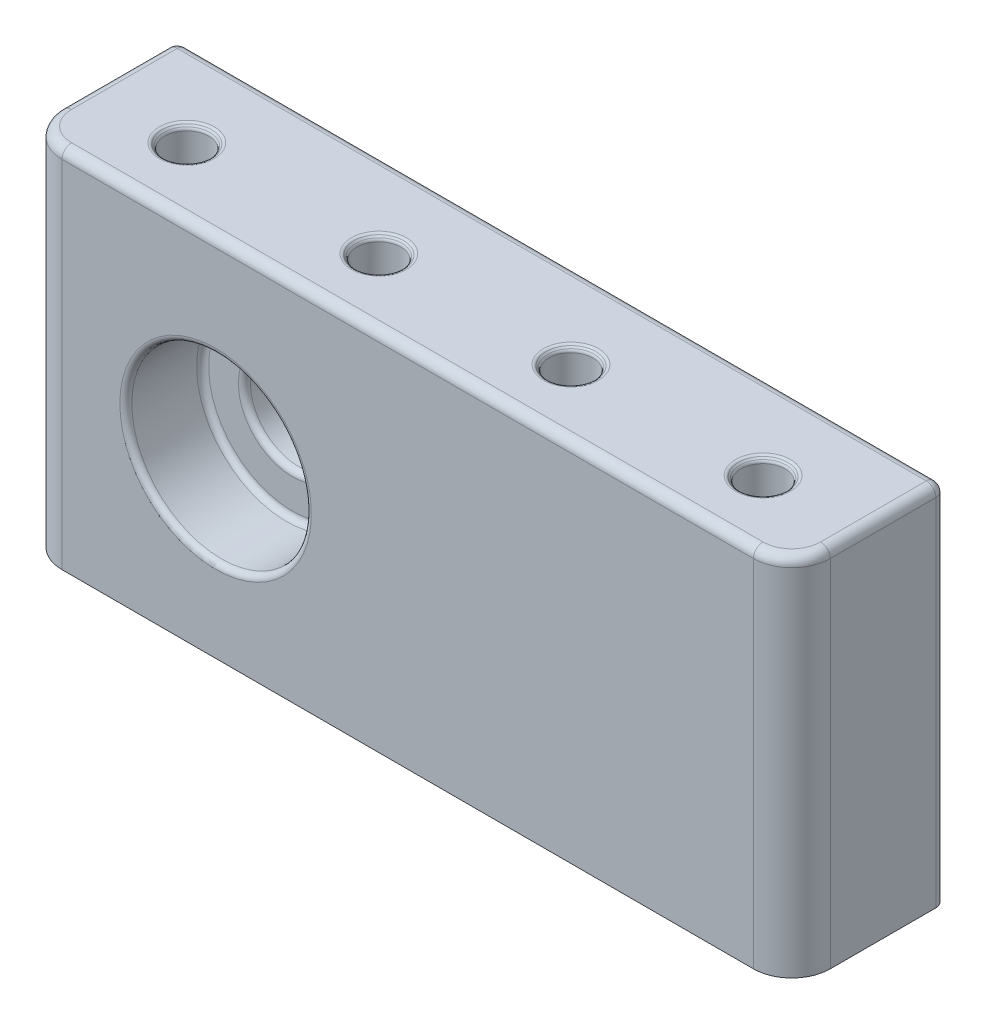
ISO-10303-21;
HEADER;
FILE_DESCRIPTION(('STEP AP214'),'2;1');
FILE_NAME('part.step','',(''),(''),'','','');
FILE_SCHEMA(('AUTOMOTIVE_DESIGN { 1 0 10303 214 1 1 1 1 }'));
ENDSEC;
DATA;
#1=APPLICATION_CONTEXT('core data for automotive mechanical design processes');
#2=APPLICATION_PROTOCOL_DEFINITION('international standard','automotive_design',2000,#1);
#3=PRODUCT_CONTEXT('',#1,'mechanical');
#4=PRODUCT('Part','Part','',(#3));
#5=PRODUCT_RELATED_PRODUCT_CATEGORY('part','',(#4));
#6=PRODUCT_DEFINITION_FORMATION('','',#4);
#7=PRODUCT_DEFINITION_CONTEXT('part definition',#1,'design');
#8=PRODUCT_DEFINITION('design','',#6,#7);
#9=PRODUCT_DEFINITION_SHAPE('','',#8);
#10=(LENGTH_UNIT() NAMED_UNIT(*) SI_UNIT(.MILLI.,.METRE.));
#11=(NAMED_UNIT(*) PLANE_ANGLE_UNIT() SI_UNIT($,.RADIAN.));
#12=(NAMED_UNIT(*) SI_UNIT($,.STERADIAN.) SOLID_ANGLE_UNIT());
#13=UNCERTAINTY_MEASURE_WITH_UNIT(LENGTH_MEASURE(1.E-05),#10,'distance_accuracy_value','');
#14=(GEOMETRIC_REPRESENTATION_CONTEXT(3) GLOBAL_UNCERTAINTY_ASSIGNED_CONTEXT((#13)) GLOBAL_UNIT_ASSIGNED_CONTEXT((#10,
#11,#12)) REPRESENTATION_CONTEXT('',''));
#15=CARTESIAN_POINT('',(0.,0.,0.));
#16=DIRECTION('',(0.,0.,1.));
#17=DIRECTION('',(1.,0.,0.));
#18=AXIS2_PLACEMENT_3D('',#15,#16,#17);
#19=CARTESIAN_POINT('',(20.,-9.5,8.));
#20=DIRECTION('',(-1.,0.,0.));
#21=DIRECTION('',(0.,0.,1.));
#22=AXIS2_PLACEMENT_3D('',#19,#20,#21);
#23=PLANE('',#22);
#24=DIRECTION('',(0.,1.,0.));
#25=VECTOR('',#24,1.);
#26=CARTESIAN_POINT('',(20.,9.5,0.5));
#27=LINE('',#26,#25);
#28=CARTESIAN_POINT('',(20.,-9.5,0.5));
#29=VERTEX_POINT('',#28);
#30=CARTESIAN_POINT('',(20.,9.,0.5));
#31=VERTEX_POINT('',#30);
#32=EDGE_CURVE('E248',#29,#31,#27,.T.);
#33=ORIENTED_EDGE('',*,*,#32,.T.);
#34=DIRECTION('',(0.,0.,-1.));
#35=VECTOR('',#34,1.);
#36=CARTESIAN_POINT('',(20.,9.,8.));
#37=LINE('',#36,#35);
#38=CARTESIAN_POINT('',(20.,9.,6.));
#39=VERTEX_POINT('',#38);
#40=EDGE_CURVE('E250',#31,#39,#37,.F.);
#41=ORIENTED_EDGE('',*,*,#40,.T.);
#42=DIRECTION('',(0.,1.,0.));
#43=VECTOR('',#42,1.);
#44=CARTESIAN_POINT('',(20.,-9.5,6.));
#45=LINE('',#44,#43);
#46=CARTESIAN_POINT('',(20.,-9.5,6.));
#47=VERTEX_POINT('',#46);
#48=EDGE_CURVE('E144',#39,#47,#45,.F.);
#49=ORIENTED_EDGE('',*,*,#48,.T.);
#50=DIRECTION('',(0.,0.,-1.));
#51=VECTOR('',#50,1.);
#52=CARTESIAN_POINT('',(20.,-9.5,8.));
#53=LINE('',#52,#51);
#54=EDGE_CURVE('E150',#47,#29,#53,.T.);
#55=ORIENTED_EDGE('',*,*,#54,.T.);
#56=EDGE_LOOP('',(#33,#41,#49,#55));
#57=FACE_BOUND('',#56,.T.);
#58=ADVANCED_FACE('F38',(#57),#23,.F.);
#59=CARTESIAN_POINT('',(-20.,9.5,8.));
#60=DIRECTION('',(0.,-1.,0.));
#61=DIRECTION('',(0.,0.,-1.));
#62=AXIS2_PLACEMENT_3D('',#59,#60,#61);
#63=PLANE('',#62);
#64=CARTESIAN_POINT('',(-18.,9.5,6.));
#65=DIRECTION('',(0.,-1.,0.));
#66=DIRECTION('',(0.,0.,-1.));
#67=AXIS2_PLACEMENT_3D('',#64,#65,#66);
#68=CIRCLE('',#67,1.5);
#69=CARTESIAN_POINT('',(-19.5,9.5,6.));
#70=VERTEX_POINT('',#69);
#71=CARTESIAN_POINT('',(-18.,9.5,7.5));
#72=VERTEX_POINT('',#71);
#73=EDGE_CURVE('E242',#70,#72,#68,.F.);
#74=ORIENTED_EDGE('',*,*,#73,.T.);
#75=DIRECTION('',(-1.,0.,0.));
#76=VECTOR('',#75,1.);
#77=CARTESIAN_POINT('',(-20.,9.5,7.5));
#78=LINE('',#77,#76);
#79=CARTESIAN_POINT('',(18.,9.5,7.5));
#80=VERTEX_POINT('',#79);
#81=EDGE_CURVE('E246',#72,#80,#78,.F.);
#82=ORIENTED_EDGE('',*,*,#81,.T.);
#83=CARTESIAN_POINT('',(18.,9.5,6.));
#84=DIRECTION('',(0.,-1.,0.));
#85=DIRECTION('',(0.,0.,-1.));
#86=AXIS2_PLACEMENT_3D('',#83,#84,#85);
#87=CIRCLE('',#86,1.5);
#88=CARTESIAN_POINT('',(19.5,9.5,6.));
#89=VERTEX_POINT('',#88);
#90=EDGE_CURVE('E244',#80,#89,#87,.F.);
#91=ORIENTED_EDGE('',*,*,#90,.T.);
#92=DIRECTION('',(0.,0.,-1.));
#93=VECTOR('',#92,1.);
#94=CARTESIAN_POINT('',(19.5,9.5,8.));
#95=LINE('',#94,#93);
#96=CARTESIAN_POINT('',(19.5,9.5,0.5));
#97=VERTEX_POINT('',#96);
#98=EDGE_CURVE('E239',#89,#97,#95,.T.);
#99=ORIENTED_EDGE('',*,*,#98,.T.);
#100=DIRECTION('',(-1.,0.,0.));
#101=VECTOR('',#100,1.);
#102=CARTESIAN_POINT('',(-20.,9.5,0.5));
#103=LINE('',#102,#101);
#104=CARTESIAN_POINT('',(-19.5,9.5,0.5));
#105=VERTEX_POINT('',#104);
#106=EDGE_CURVE('E235',#97,#105,#103,.T.);
#107=ORIENTED_EDGE('',*,*,#106,.T.);
#108=DIRECTION('',(0.,0.,-1.));
#109=VECTOR('',#108,1.);
#110=CARTESIAN_POINT('',(-19.5,9.5,8.));
#111=LINE('',#110,#109);
#112=EDGE_CURVE('E237',#105,#70,#111,.F.);
#113=ORIENTED_EDGE('',*,*,#112,.T.);
#114=EDGE_LOOP('',(#74,#82,#91,#99,#107,#113));
#115=FACE_BOUND('',#114,.T.);
#116=CARTESIAN_POINT('',(-15.,9.5,4.5));
#117=DIRECTION('',(0.,-1.,0.));
#118=DIRECTION('',(0.,0.,-1.));
#119=AXIS2_PLACEMENT_3D('',#116,#117,#118);
#120=CIRCLE('',#119,1.43284271247463);
#121=CARTESIAN_POINT('',(-15.,9.5,3.06715728752537));
#122=VERTEX_POINT('',#121);
#123=EDGE_CURVE('E205',#122,#122,#120,.T.);
#124=ORIENTED_EDGE('',*,*,#123,.T.);
#125=EDGE_LOOP('',(#124));
#126=FACE_BOUND('',#125,.T.);
#127=CARTESIAN_POINT('',(-5.,9.5,4.5));
#128=DIRECTION('',(0.,-1.,0.));
#129=DIRECTION('',(0.,0.,-1.));
#130=AXIS2_PLACEMENT_3D('',#127,#128,#129);
#131=CIRCLE('',#130,1.43284271247463);
#132=CARTESIAN_POINT('',(-5.,9.5,3.06715728752537));
#133=VERTEX_POINT('',#132);
#134=EDGE_CURVE('E202',#133,#133,#131,.T.);
#135=ORIENTED_EDGE('',*,*,#134,.T.);
#136=EDGE_LOOP('',(#135));
#137=FACE_BOUND('',#136,.T.);
#138=CARTESIAN_POINT('',(5.,9.5,4.5));
#139=DIRECTION('',(0.,-1.,0.));
#140=DIRECTION('',(0.,0.,-1.));
#141=AXIS2_PLACEMENT_3D('',#138,#139,#140);
#142=CIRCLE('',#141,1.43284271247463);
#143=CARTESIAN_POINT('',(5.,9.5,3.06715728752537));
#144=VERTEX_POINT('',#143);
#145=EDGE_CURVE('E199',#144,#144,#142,.T.);
#146=ORIENTED_EDGE('',*,*,#145,.T.);
#147=EDGE_LOOP('',(#146));
#148=FACE_BOUND('',#147,.T.);
#149=CARTESIAN_POINT('',(15.,9.5,4.5));
#150=DIRECTION('',(0.,-1.,0.));
#151=DIRECTION('',(0.,0.,-1.));
#152=AXIS2_PLACEMENT_3D('',#149,#150,#151);
#153=CIRCLE('',#152,1.43284271247463);
#154=CARTESIAN_POINT('',(15.,9.5,3.06715728752537));
#155=VERTEX_POINT('',#154);
#156=EDGE_CURVE('E196',#155,#155,#153,.T.);
#157=ORIENTED_EDGE('',*,*,#156,.T.);
#158=EDGE_LOOP('',(#157));
#159=FACE_BOUND('',#158,.T.);
#160=ADVANCED_FACE('F356',(#115,#126,#137,#148,#159),#63,.F.);
#161=CARTESIAN_POINT('',(-20.,-9.5,8.));
#162=DIRECTION('',(1.,0.,0.));
#163=DIRECTION('',(0.,0.,-1.));
#164=AXIS2_PLACEMENT_3D('',#161,#162,#163);
#165=PLANE('',#164);
#166=DIRECTION('',(0.,-1.,0.));
#167=VECTOR('',#166,1.);
#168=CARTESIAN_POINT('',(-20.,-9.5,6.));
#169=LINE('',#168,#167);
#170=CARTESIAN_POINT('',(-20.,-9.5,6.));
#171=VERTEX_POINT('',#170);
#172=CARTESIAN_POINT('',(-20.,9.,6.));
#173=VERTEX_POINT('',#172);
#174=EDGE_CURVE('E139',#171,#173,#169,.F.);
#175=ORIENTED_EDGE('',*,*,#174,.T.);
#176=DIRECTION('',(0.,0.,-1.));
#177=VECTOR('',#176,1.);
#178=CARTESIAN_POINT('',(-20.,9.,8.));
#179=LINE('',#178,#177);
#180=CARTESIAN_POINT('',(-20.,9.,0.5));
#181=VERTEX_POINT('',#180);
#182=EDGE_CURVE('E257',#173,#181,#179,.T.);
#183=ORIENTED_EDGE('',*,*,#182,.T.);
#184=DIRECTION('',(0.,-1.,0.));
#185=VECTOR('',#184,1.);
#186=CARTESIAN_POINT('',(-20.,-9.5,0.5));
#187=LINE('',#186,#185);
#188=CARTESIAN_POINT('',(-20.,-9.5,0.5));
#189=VERTEX_POINT('',#188);
#190=EDGE_CURVE('E255',#181,#189,#187,.T.);
#191=ORIENTED_EDGE('',*,*,#190,.T.);
#192=DIRECTION('',(0.,0.,-1.));
#193=VECTOR('',#192,1.);
#194=CARTESIAN_POINT('',(-20.,-9.5,8.));
#195=LINE('',#194,#193);
#196=EDGE_CURVE('E133',#171,#189,#195,.T.);
#197=ORIENTED_EDGE('',*,*,#196,.F.);
#198=EDGE_LOOP('',(#175,#183,#191,#197));
#199=FACE_BOUND('',#198,.T.);
#200=ADVANCED_FACE('F362',(#199),#165,.F.);
#201=CARTESIAN_POINT('',(-20.,-9.5,8.));
#202=DIRECTION('',(0.,1.,0.));
#203=DIRECTION('',(0.,0.,1.));
#204=AXIS2_PLACEMENT_3D('',#201,#202,#203);
#205=PLANE('',#204);
#206=DIRECTION('',(1.,0.,0.));
#207=VECTOR('',#206,1.);
#208=CARTESIAN_POINT('',(-20.,-9.5,0.));
#209=LINE('',#208,#207);
#210=CARTESIAN_POINT('',(-19.5,-9.5,0.));
#211=VERTEX_POINT('',#210);
#212=CARTESIAN_POINT('',(19.5,-9.5,0.));
#213=VERTEX_POINT('',#212);
#214=EDGE_CURVE('E151',#211,#213,#209,.T.);
#215=ORIENTED_EDGE('',*,*,#214,.T.);
#216=CARTESIAN_POINT('',(19.5,-9.5,0.5));
#217=DIRECTION('',(0.,1.,0.));
#218=DIRECTION('',(0.,0.,1.));
#219=AXIS2_PLACEMENT_3D('',#216,#217,#218);
#220=CIRCLE('',#219,0.5);
#221=EDGE_CURVE('E268',#213,#29,#220,.F.);
#222=ORIENTED_EDGE('',*,*,#221,.T.);
#223=ORIENTED_EDGE('',*,*,#54,.F.);
#224=CARTESIAN_POINT('',(18.,-9.5,6.));
#225=DIRECTION('',(0.,1.,0.));
#226=DIRECTION('',(0.,0.,1.));
#227=AXIS2_PLACEMENT_3D('',#224,#225,#226);
#228=CIRCLE('',#227,2.);
#229=CARTESIAN_POINT('',(18.,-9.5,8.));
#230=VERTEX_POINT('',#229);
#231=EDGE_CURVE('E143',#47,#230,#228,.F.);
#232=ORIENTED_EDGE('',*,*,#231,.T.);
#233=DIRECTION('',(1.,0.,0.));
#234=VECTOR('',#233,1.);
#235=CARTESIAN_POINT('',(-20.,-9.5,8.));
#236=LINE('',#235,#234);
#237=CARTESIAN_POINT('',(-18.,-9.5,8.));
#238=VERTEX_POINT('',#237);
#239=EDGE_CURVE('E126',#238,#230,#236,.T.);
#240=ORIENTED_EDGE('',*,*,#239,.F.);
#241=CARTESIAN_POINT('',(-18.,-9.5,6.));
#242=DIRECTION('',(0.,1.,0.));
#243=DIRECTION('',(0.,0.,1.));
#244=AXIS2_PLACEMENT_3D('',#241,#242,#243);
#245=CIRCLE('',#244,2.);
#246=EDGE_CURVE('E136',#238,#171,#245,.F.);
#247=ORIENTED_EDGE('',*,*,#246,.T.);
#248=ORIENTED_EDGE('',*,*,#196,.T.);
#249=CARTESIAN_POINT('',(-19.5,-9.5,0.5));
#250=DIRECTION('',(0.,1.,0.));
#251=DIRECTION('',(0.,0.,1.));
#252=AXIS2_PLACEMENT_3D('',#249,#250,#251);
#253=CIRCLE('',#252,0.5);
#254=EDGE_CURVE('E266',#189,#211,#253,.F.);
#255=ORIENTED_EDGE('',*,*,#254,.T.);
#256=EDGE_LOOP('',(#215,#222,#223,#232,#240,#247,#248,#255));
#257=FACE_BOUND('',#256,.T.);
#258=ADVANCED_FACE('F147',(#257),#205,.F.);
#259=CARTESIAN_POINT('',(0.,0.,8.));
#260=DIRECTION('',(0.,0.,-1.));
#261=DIRECTION('',(-1.,0.,0.));
#262=AXIS2_PLACEMENT_3D('',#259,#260,#261);
#263=PLANE('',#262);
#264=CARTESIAN_POINT('',(-9.99999999999999,-0.499999999999999,8.));
#265=DIRECTION('',(0.,0.,-1.));
#266=DIRECTION('',(-1.,0.,0.));
#267=AXIS2_PLACEMENT_3D('',#264,#265,#266);
#268=CIRCLE('',#267,4.9875);
#269=CARTESIAN_POINT('',(-14.9875,-0.499999999999999,8.));
#270=VERTEX_POINT('',#269);
#271=EDGE_CURVE('E11',#270,#270,#268,.T.);
#272=ORIENTED_EDGE('',*,*,#271,.T.);
#273=EDGE_LOOP('',(#272));
#274=FACE_BOUND('',#273,.T.);
#275=DIRECTION('',(0.,1.,0.));
#276=VECTOR('',#275,1.);
#277=CARTESIAN_POINT('',(18.,0.,8.));
#278=LINE('',#277,#276);
#279=CARTESIAN_POINT('',(18.,9.,8.));
#280=VERTEX_POINT('',#279);
#281=EDGE_CURVE('E132',#230,#280,#278,.T.);
#282=ORIENTED_EDGE('',*,*,#281,.T.);
#283=DIRECTION('',(-1.,0.,0.));
#284=VECTOR('',#283,1.);
#285=CARTESIAN_POINT('',(0.,9.,8.));
#286=LINE('',#285,#284);
#287=CARTESIAN_POINT('',(-18.,9.,8.));
#288=VERTEX_POINT('',#287);
#289=EDGE_CURVE('E129',#280,#288,#286,.T.);
#290=ORIENTED_EDGE('',*,*,#289,.T.);
#291=DIRECTION('',(0.,-1.,0.));
#292=VECTOR('',#291,1.);
#293=CARTESIAN_POINT('',(-18.,0.,8.));
#294=LINE('',#293,#292);
#295=EDGE_CURVE('E121',#288,#238,#294,.T.);
#296=ORIENTED_EDGE('',*,*,#295,.T.);
#297=ORIENTED_EDGE('',*,*,#239,.T.);
#298=EDGE_LOOP('',(#282,#290,#296,#297));
#299=FACE_BOUND('',#298,.T.);
#300=ADVANCED_FACE('F124',(#274,#299),#263,.F.);
#301=CARTESIAN_POINT('',(0.,0.,0.));
#302=DIRECTION('',(0.,0.,-1.));
#303=DIRECTION('',(-1.,0.,0.));
#304=AXIS2_PLACEMENT_3D('',#301,#302,#303);
#305=PLANE('',#304);
#306=CARTESIAN_POINT('',(-9.99999999999999,-0.499999999999999,0.));
#307=DIRECTION('',(0.,0.,-1.));
#308=DIRECTION('',(-1.,0.,0.));
#309=AXIS2_PLACEMENT_3D('',#306,#307,#308);
#310=CIRCLE('',#309,4.1294417382416);
#311=CARTESIAN_POINT('',(-14.1294417382416,-0.499999999999999,0.));
#312=VERTEX_POINT('',#311);
#313=EDGE_CURVE('E270',#312,#312,#310,.F.);
#314=ORIENTED_EDGE('',*,*,#313,.T.);
#315=EDGE_LOOP('',(#314));
#316=FACE_BOUND('',#315,.T.);
#317=DIRECTION('',(-1.,0.,0.));
#318=VECTOR('',#317,1.);
#319=CARTESIAN_POINT('',(20.,9.,0.));
#320=LINE('',#319,#318);
#321=CARTESIAN_POINT('',(-19.5,9.,0.));
#322=VERTEX_POINT('',#321);
#323=CARTESIAN_POINT('',(19.5,9.,0.));
#324=VERTEX_POINT('',#323);
#325=EDGE_CURVE('E53',#322,#324,#320,.F.);
#326=ORIENTED_EDGE('',*,*,#325,.T.);
#327=DIRECTION('',(0.,1.,0.));
#328=VECTOR('',#327,1.);
#329=CARTESIAN_POINT('',(19.5,-9.5,0.));
#330=LINE('',#329,#328);
#331=EDGE_CURVE('E264',#324,#213,#330,.F.);
#332=ORIENTED_EDGE('',*,*,#331,.T.);
#333=ORIENTED_EDGE('',*,*,#214,.F.);
#334=DIRECTION('',(0.,-1.,0.));
#335=VECTOR('',#334,1.);
#336=CARTESIAN_POINT('',(-19.5,9.5,0.));
#337=LINE('',#336,#335);
#338=EDGE_CURVE('E58',#211,#322,#337,.F.);
#339=ORIENTED_EDGE('',*,*,#338,.T.);
#340=EDGE_LOOP('',(#326,#332,#333,#339));
#341=FACE_BOUND('',#340,.T.);
#342=ADVANCED_FACE('F370',(#316,#341),#305,.T.);
#343=CARTESIAN_POINT('',(18.,0.,6.));
#344=DIRECTION('',(0.,1.,0.));
#345=DIRECTION('',(0.,0.,1.));
#346=AXIS2_PLACEMENT_3D('',#343,#344,#345);
#347=CYLINDRICAL_SURFACE('',#346,2.);
#348=ORIENTED_EDGE('',*,*,#48,.F.);
#349=CARTESIAN_POINT('',(18.,9.,6.));
#350=DIRECTION('',(0.,-1.,0.));
#351=DIRECTION('',(0.,0.,-1.));
#352=AXIS2_PLACEMENT_3D('',#349,#350,#351);
#353=CIRCLE('',#352,2.);
#354=EDGE_CURVE('E253',#39,#280,#353,.T.);
#355=ORIENTED_EDGE('',*,*,#354,.T.);
#356=ORIENTED_EDGE('',*,*,#281,.F.);
#357=ORIENTED_EDGE('',*,*,#231,.F.);
#358=EDGE_LOOP('',(#348,#355,#356,#357));
#359=FACE_BOUND('',#358,.T.);
#360=ADVANCED_FACE('F367',(#359),#347,.T.);
#361=CARTESIAN_POINT('',(-18.,0.,6.));
#362=DIRECTION('',(0.,-1.,0.));
#363=DIRECTION('',(0.,0.,-1.));
#364=AXIS2_PLACEMENT_3D('',#361,#362,#363);
#365=CYLINDRICAL_SURFACE('',#364,2.);
#366=ORIENTED_EDGE('',*,*,#295,.F.);
#367=CARTESIAN_POINT('',(-18.,9.,6.));
#368=DIRECTION('',(0.,-1.,0.));
#369=DIRECTION('',(0.,0.,-1.));
#370=AXIS2_PLACEMENT_3D('',#367,#368,#369);
#371=CIRCLE('',#370,2.);
#372=EDGE_CURVE('E259',#288,#173,#371,.T.);
#373=ORIENTED_EDGE('',*,*,#372,.T.);
#374=ORIENTED_EDGE('',*,*,#174,.F.);
#375=ORIENTED_EDGE('',*,*,#246,.F.);
#376=EDGE_LOOP('',(#366,#373,#374,#375));
#377=FACE_BOUND('',#376,.T.);
#378=ADVANCED_FACE('F137',(#377),#365,.T.);
#379=CARTESIAN_POINT('',(15.,2.5,4.5));
#380=DIRECTION('',(0.,1.,0.));
#381=DIRECTION('',(0.,0.,1.));
#382=AXIS2_PLACEMENT_3D('',#379,#380,#381);
#383=CYLINDRICAL_SURFACE('',#382,1.15);
#384=CARTESIAN_POINT('',(15.,9.21715728752537,4.5));
#385=DIRECTION('',(0.,-1.,0.));
#386=DIRECTION('',(0.,0.,-1.));
#387=AXIS2_PLACEMENT_3D('',#384,#385,#386);
#388=CIRCLE('',#387,1.15);
#389=CARTESIAN_POINT('',(15.,9.21715728752537,3.35));
#390=VERTEX_POINT('',#389);
#391=EDGE_CURVE('E226',#390,#390,#388,.F.);
#392=ORIENTED_EDGE('',*,*,#391,.T.);
#393=EDGE_LOOP('',(#392));
#394=FACE_BOUND('',#393,.T.);
#395=CARTESIAN_POINT('',(15.,2.70000000000001,4.5));
#396=DIRECTION('',(0.,1.,0.));
#397=DIRECTION('',(0.,0.,1.));
#398=AXIS2_PLACEMENT_3D('',#395,#396,#397);
#399=CIRCLE('',#398,1.15);
#400=CARTESIAN_POINT('',(15.,2.70000000000001,5.65));
#401=VERTEX_POINT('',#400);
#402=EDGE_CURVE('E163',#401,#401,#399,.F.);
#403=ORIENTED_EDGE('',*,*,#402,.T.);
#404=EDGE_LOOP('',(#403));
#405=FACE_BOUND('',#404,.T.);
#406=ADVANCED_FACE('F374',(#394,#405),#383,.F.);
#407=CARTESIAN_POINT('',(15.,2.5,4.5));
#408=DIRECTION('',(0.,1.,0.));
#409=DIRECTION('',(0.,0.,1.));
#410=AXIS2_PLACEMENT_3D('',#407,#408,#409);
#411=PLANE('',#410);
#412=CARTESIAN_POINT('',(15.,2.5,4.5));
#413=DIRECTION('',(0.,1.,0.));
#414=DIRECTION('',(0.,0.,1.));
#415=AXIS2_PLACEMENT_3D('',#412,#413,#414);
#416=CIRCLE('',#415,0.949999999999986);
#417=CARTESIAN_POINT('',(15.,2.5,5.44999999999999));
#418=VERTEX_POINT('',#417);
#419=EDGE_CURVE('E166',#418,#418,#416,.T.);
#420=ORIENTED_EDGE('',*,*,#419,.T.);
#421=EDGE_LOOP('',(#420));
#422=FACE_BOUND('',#421,.T.);
#423=ADVANCED_FACE('F546',(#422),#411,.T.);
#424=CARTESIAN_POINT('',(5.,2.5,4.5));
#425=DIRECTION('',(0.,1.,0.));
#426=DIRECTION('',(0.,0.,1.));
#427=AXIS2_PLACEMENT_3D('',#424,#425,#426);
#428=CYLINDRICAL_SURFACE('',#427,1.15);
#429=CARTESIAN_POINT('',(5.,9.21715728752537,4.5));
#430=DIRECTION('',(0.,-1.,0.));
#431=DIRECTION('',(0.,0.,-1.));
#432=AXIS2_PLACEMENT_3D('',#429,#430,#431);
#433=CIRCLE('',#432,1.15);
#434=CARTESIAN_POINT('',(5.,9.21715728752537,3.35));
#435=VERTEX_POINT('',#434);
#436=EDGE_CURVE('E217',#435,#435,#433,.F.);
#437=ORIENTED_EDGE('',*,*,#436,.T.);
#438=EDGE_LOOP('',(#437));
#439=FACE_BOUND('',#438,.T.);
#440=CARTESIAN_POINT('',(5.,2.70000000000001,4.5));
#441=DIRECTION('',(0.,1.,0.));
#442=DIRECTION('',(0.,0.,1.));
#443=AXIS2_PLACEMENT_3D('',#440,#441,#442);
#444=CIRCLE('',#443,1.15);
#445=CARTESIAN_POINT('',(5.,2.70000000000001,5.65));
#446=VERTEX_POINT('',#445);
#447=EDGE_CURVE('E169',#446,#446,#444,.F.);
#448=ORIENTED_EDGE('',*,*,#447,.T.);
#449=EDGE_LOOP('',(#448));
#450=FACE_BOUND('',#449,.T.);
#451=ADVANCED_FACE('F542',(#439,#450),#428,.F.);
#452=CARTESIAN_POINT('',(5.,2.5,4.5));
#453=DIRECTION('',(0.,1.,0.));
#454=DIRECTION('',(0.,0.,1.));
#455=AXIS2_PLACEMENT_3D('',#452,#453,#454);
#456=PLANE('',#455);
#457=CARTESIAN_POINT('',(5.,2.5,4.5));
#458=DIRECTION('',(0.,1.,0.));
#459=DIRECTION('',(0.,0.,1.));
#460=AXIS2_PLACEMENT_3D('',#457,#458,#459);
#461=CIRCLE('',#460,0.949999999999986);
#462=CARTESIAN_POINT('',(5.,2.5,5.44999999999999));
#463=VERTEX_POINT('',#462);
#464=EDGE_CURVE('E172',#463,#463,#461,.T.);
#465=ORIENTED_EDGE('',*,*,#464,.T.);
#466=EDGE_LOOP('',(#465));
#467=FACE_BOUND('',#466,.T.);
#468=ADVANCED_FACE('F538',(#467),#456,.T.);
#469=CARTESIAN_POINT('',(-5.,2.5,4.5));
#470=DIRECTION('',(0.,1.,0.));
#471=DIRECTION('',(0.,0.,1.));
#472=AXIS2_PLACEMENT_3D('',#469,#470,#471);
#473=CYLINDRICAL_SURFACE('',#472,1.15);
#474=CARTESIAN_POINT('',(-5.,9.21715728752537,4.5));
#475=DIRECTION('',(0.,-1.,0.));
#476=DIRECTION('',(0.,0.,-1.));
#477=AXIS2_PLACEMENT_3D('',#474,#475,#476);
#478=CIRCLE('',#477,1.15);
#479=CARTESIAN_POINT('',(-5.,9.21715728752537,3.35));
#480=VERTEX_POINT('',#479);
#481=EDGE_CURVE('E208',#480,#480,#478,.F.);
#482=ORIENTED_EDGE('',*,*,#481,.T.);
#483=EDGE_LOOP('',(#482));
#484=FACE_BOUND('',#483,.T.);
#485=CARTESIAN_POINT('',(-5.,2.70000000000001,4.5));
#486=DIRECTION('',(0.,1.,0.));
#487=DIRECTION('',(0.,0.,1.));
#488=AXIS2_PLACEMENT_3D('',#485,#486,#487);
#489=CIRCLE('',#488,1.15);
#490=CARTESIAN_POINT('',(-5.,2.70000000000001,5.65));
#491=VERTEX_POINT('',#490);
#492=EDGE_CURVE('E175',#491,#491,#489,.F.);
#493=ORIENTED_EDGE('',*,*,#492,.T.);
#494=EDGE_LOOP('',(#493));
#495=FACE_BOUND('',#494,.T.);
#496=ADVANCED_FACE('F534',(#484,#495),#473,.F.);
#497=CARTESIAN_POINT('',(-5.,2.5,4.5));
#498=DIRECTION('',(0.,1.,0.));
#499=DIRECTION('',(0.,0.,1.));
#500=AXIS2_PLACEMENT_3D('',#497,#498,#499);
#501=PLANE('',#500);
#502=CARTESIAN_POINT('',(-5.,2.5,4.5));
#503=DIRECTION('',(0.,1.,0.));
#504=DIRECTION('',(0.,0.,1.));
#505=AXIS2_PLACEMENT_3D('',#502,#503,#504);
#506=CIRCLE('',#505,0.949999999999986);
#507=CARTESIAN_POINT('',(-5.,2.5,5.44999999999999));
#508=VERTEX_POINT('',#507);
#509=EDGE_CURVE('E178',#508,#508,#506,.T.);
#510=ORIENTED_EDGE('',*,*,#509,.T.);
#511=EDGE_LOOP('',(#510));
#512=FACE_BOUND('',#511,.T.);
#513=ADVANCED_FACE('F530',(#512),#501,.T.);
#514=CARTESIAN_POINT('',(-15.,2.5,4.5));
#515=DIRECTION('',(0.,1.,0.));
#516=DIRECTION('',(0.,0.,1.));
#517=AXIS2_PLACEMENT_3D('',#514,#515,#516);
#518=CYLINDRICAL_SURFACE('',#517,1.15);
#519=CARTESIAN_POINT('',(-15.,9.21715728752537,4.5));
#520=DIRECTION('',(0.,-1.,0.));
#521=DIRECTION('',(0.,0.,-1.));
#522=AXIS2_PLACEMENT_3D('',#519,#520,#521);
#523=CIRCLE('',#522,1.15);
#524=CARTESIAN_POINT('',(-15.,9.21715728752537,3.35));
#525=VERTEX_POINT('',#524);
#526=EDGE_CURVE('E187',#525,#525,#523,.F.);
#527=ORIENTED_EDGE('',*,*,#526,.T.);
#528=EDGE_LOOP('',(#527));
#529=FACE_BOUND('',#528,.T.);
#530=CARTESIAN_POINT('',(-15.,2.70000000000001,4.5));
#531=DIRECTION('',(0.,1.,0.));
#532=DIRECTION('',(0.,0.,1.));
#533=AXIS2_PLACEMENT_3D('',#530,#531,#532);
#534=CIRCLE('',#533,1.15);
#535=CARTESIAN_POINT('',(-15.,2.70000000000001,5.65));
#536=VERTEX_POINT('',#535);
#537=EDGE_CURVE('E181',#536,#536,#534,.F.);
#538=ORIENTED_EDGE('',*,*,#537,.T.);
#539=EDGE_LOOP('',(#538));
#540=FACE_BOUND('',#539,.T.);
#541=ADVANCED_FACE('F526',(#529,#540),#518,.F.);
#542=CARTESIAN_POINT('',(-15.,2.5,4.5));
#543=DIRECTION('',(0.,1.,0.));
#544=DIRECTION('',(0.,0.,1.));
#545=AXIS2_PLACEMENT_3D('',#542,#543,#544);
#546=PLANE('',#545);
#547=CARTESIAN_POINT('',(-15.,2.5,4.5));
#548=DIRECTION('',(0.,1.,0.));
#549=DIRECTION('',(0.,0.,1.));
#550=AXIS2_PLACEMENT_3D('',#547,#548,#549);
#551=CIRCLE('',#550,0.949999999999986);
#552=CARTESIAN_POINT('',(-15.,2.5,5.44999999999999));
#553=VERTEX_POINT('',#552);
#554=EDGE_CURVE('E184',#553,#553,#551,.T.);
#555=ORIENTED_EDGE('',*,*,#554,.T.);
#556=EDGE_LOOP('',(#555));
#557=FACE_BOUND('',#556,.T.);
#558=ADVANCED_FACE('F383',(#557),#546,.T.);
#559=CARTESIAN_POINT('',(15.,9.29999999999999,4.5));
#560=DIRECTION('',(0.,1.,0.));
#561=DIRECTION('',(0.,0.,1.));
#562=AXIS2_PLACEMENT_3D('',#559,#560,#561);
#563=CONICAL_SURFACE('',#562,1.15,0.785398163397457);
#564=CARTESIAN_POINT('',(15.,9.35857864376269,4.5));
#565=DIRECTION('',(0.,1.,0.));
#566=DIRECTION('',(0.,0.,1.));
#567=AXIS2_PLACEMENT_3D('',#564,#565,#566);
#568=CIRCLE('',#567,1.20857864376269);
#569=CARTESIAN_POINT('',(15.,9.35857864376269,5.70857864376269));
#570=VERTEX_POINT('',#569);
#571=EDGE_CURVE('E232',#570,#570,#568,.F.);
#572=ORIENTED_EDGE('',*,*,#571,.T.);
#573=EDGE_LOOP('',(#572));
#574=FACE_BOUND('',#573,.T.);
#575=CARTESIAN_POINT('',(15.,9.44142135623731,4.5));
#576=DIRECTION('',(0.,1.,0.));
#577=DIRECTION('',(0.,0.,1.));
#578=AXIS2_PLACEMENT_3D('',#575,#576,#577);
#579=CIRCLE('',#578,1.29142135623732);
#580=CARTESIAN_POINT('',(15.,9.44142135623731,5.79142135623732));
#581=VERTEX_POINT('',#580);
#582=EDGE_CURVE('E229',#581,#581,#579,.T.);
#583=ORIENTED_EDGE('',*,*,#582,.T.);
#584=EDGE_LOOP('',(#583));
#585=FACE_BOUND('',#584,.T.);
#586=ADVANCED_FACE('F376',(#574,#585),#563,.F.);
#587=CARTESIAN_POINT('',(15.,2.5,4.5));
#588=DIRECTION('',(0.,1.,0.));
#589=DIRECTION('',(0.,0.,1.));
#590=AXIS2_PLACEMENT_3D('',#587,#588,#589);
#591=CONICAL_SURFACE('',#590,0.949999999999986,0.785398163397466);
#592=ORIENTED_EDGE('',*,*,#402,.F.);
#593=EDGE_LOOP('',(#592));
#594=FACE_BOUND('',#593,.T.);
#595=ORIENTED_EDGE('',*,*,#419,.F.);
#596=EDGE_LOOP('',(#595));
#597=FACE_BOUND('',#596,.T.);
#598=ADVANCED_FACE('F382',(#594,#597),#591,.F.);
#599=CARTESIAN_POINT('',(5.,9.29999999999999,4.5));
#600=DIRECTION('',(0.,1.,0.));
#601=DIRECTION('',(0.,0.,1.));
#602=AXIS2_PLACEMENT_3D('',#599,#600,#601);
#603=CONICAL_SURFACE('',#602,1.15,0.785398163397457);
#604=CARTESIAN_POINT('',(5.,9.35857864376269,4.5));
#605=DIRECTION('',(0.,1.,0.));
#606=DIRECTION('',(0.,0.,1.));
#607=AXIS2_PLACEMENT_3D('',#604,#605,#606);
#608=CIRCLE('',#607,1.20857864376269);
#609=CARTESIAN_POINT('',(5.,9.35857864376269,5.70857864376269));
#610=VERTEX_POINT('',#609);
#611=EDGE_CURVE('E223',#610,#610,#608,.F.);
#612=ORIENTED_EDGE('',*,*,#611,.T.);
#613=EDGE_LOOP('',(#612));
#614=FACE_BOUND('',#613,.T.);
#615=CARTESIAN_POINT('',(5.,9.44142135623731,4.5));
#616=DIRECTION('',(0.,1.,0.));
#617=DIRECTION('',(0.,0.,1.));
#618=AXIS2_PLACEMENT_3D('',#615,#616,#617);
#619=CIRCLE('',#618,1.29142135623732);
#620=CARTESIAN_POINT('',(5.,9.44142135623731,5.79142135623732));
#621=VERTEX_POINT('',#620);
#622=EDGE_CURVE('E220',#621,#621,#619,.T.);
#623=ORIENTED_EDGE('',*,*,#622,.T.);
#624=EDGE_LOOP('',(#623));
#625=FACE_BOUND('',#624,.T.);
#626=ADVANCED_FACE('F390',(#614,#625),#603,.F.);
#627=CARTESIAN_POINT('',(5.,2.5,4.5));
#628=DIRECTION('',(0.,1.,0.));
#629=DIRECTION('',(0.,0.,1.));
#630=AXIS2_PLACEMENT_3D('',#627,#628,#629);
#631=CONICAL_SURFACE('',#630,0.949999999999986,0.785398163397466);
#632=ORIENTED_EDGE('',*,*,#447,.F.);
#633=EDGE_LOOP('',(#632));
#634=FACE_BOUND('',#633,.T.);
#635=ORIENTED_EDGE('',*,*,#464,.F.);
#636=EDGE_LOOP('',(#635));
#637=FACE_BOUND('',#636,.T.);
#638=ADVANCED_FACE('F397',(#634,#637),#631,.F.);
#639=CARTESIAN_POINT('',(-5.,9.29999999999999,4.5));
#640=DIRECTION('',(0.,1.,0.));
#641=DIRECTION('',(0.,0.,1.));
#642=AXIS2_PLACEMENT_3D('',#639,#640,#641);
#643=CONICAL_SURFACE('',#642,1.15,0.785398163397457);
#644=CARTESIAN_POINT('',(-5.,9.35857864376269,4.5));
#645=DIRECTION('',(0.,1.,0.));
#646=DIRECTION('',(0.,0.,1.));
#647=AXIS2_PLACEMENT_3D('',#644,#645,#646);
#648=CIRCLE('',#647,1.20857864376269);
#649=CARTESIAN_POINT('',(-5.,9.35857864376269,5.70857864376269));
#650=VERTEX_POINT('',#649);
#651=EDGE_CURVE('E214',#650,#650,#648,.F.);
#652=ORIENTED_EDGE('',*,*,#651,.T.);
#653=EDGE_LOOP('',(#652));
#654=FACE_BOUND('',#653,.T.);
#655=CARTESIAN_POINT('',(-5.,9.44142135623731,4.5));
#656=DIRECTION('',(0.,1.,0.));
#657=DIRECTION('',(0.,0.,1.));
#658=AXIS2_PLACEMENT_3D('',#655,#656,#657);
#659=CIRCLE('',#658,1.29142135623732);
#660=CARTESIAN_POINT('',(-5.,9.44142135623731,5.79142135623732));
#661=VERTEX_POINT('',#660);
#662=EDGE_CURVE('E211',#661,#661,#659,.T.);
#663=ORIENTED_EDGE('',*,*,#662,.T.);
#664=EDGE_LOOP('',(#663));
#665=FACE_BOUND('',#664,.T.);
#666=ADVANCED_FACE('F404',(#654,#665),#643,.F.);
#667=CARTESIAN_POINT('',(-5.,2.5,4.5));
#668=DIRECTION('',(0.,1.,0.));
#669=DIRECTION('',(0.,0.,1.));
#670=AXIS2_PLACEMENT_3D('',#667,#668,#669);
#671=CONICAL_SURFACE('',#670,0.949999999999986,0.785398163397466);
#672=ORIENTED_EDGE('',*,*,#492,.F.);
#673=EDGE_LOOP('',(#672));
#674=FACE_BOUND('',#673,.T.);
#675=ORIENTED_EDGE('',*,*,#509,.F.);
#676=EDGE_LOOP('',(#675));
#677=FACE_BOUND('',#676,.T.);
#678=ADVANCED_FACE('F411',(#674,#677),#671,.F.);
#679=CARTESIAN_POINT('',(-15.,9.29999999999999,4.5));
#680=DIRECTION('',(0.,1.,0.));
#681=DIRECTION('',(0.,0.,1.));
#682=AXIS2_PLACEMENT_3D('',#679,#680,#681);
#683=CONICAL_SURFACE('',#682,1.15,0.785398163397457);
#684=CARTESIAN_POINT('',(-15.,9.35857864376269,4.5));
#685=DIRECTION('',(0.,1.,0.));
#686=DIRECTION('',(0.,0.,1.));
#687=AXIS2_PLACEMENT_3D('',#684,#685,#686);
#688=CIRCLE('',#687,1.20857864376269);
#689=CARTESIAN_POINT('',(-15.,9.35857864376269,5.70857864376269));
#690=VERTEX_POINT('',#689);
#691=EDGE_CURVE('E193',#690,#690,#688,.F.);
#692=ORIENTED_EDGE('',*,*,#691,.T.);
#693=EDGE_LOOP('',(#692));
#694=FACE_BOUND('',#693,.T.);
#695=CARTESIAN_POINT('',(-15.,9.44142135623731,4.5));
#696=DIRECTION('',(0.,1.,0.));
#697=DIRECTION('',(0.,0.,1.));
#698=AXIS2_PLACEMENT_3D('',#695,#696,#697);
#699=CIRCLE('',#698,1.29142135623732);
#700=CARTESIAN_POINT('',(-15.,9.44142135623731,5.79142135623732));
#701=VERTEX_POINT('',#700);
#702=EDGE_CURVE('E190',#701,#701,#699,.T.);
#703=ORIENTED_EDGE('',*,*,#702,.T.);
#704=EDGE_LOOP('',(#703));
#705=FACE_BOUND('',#704,.T.);
#706=ADVANCED_FACE('F418',(#694,#705),#683,.F.);
#707=CARTESIAN_POINT('',(-15.,2.5,4.5));
#708=DIRECTION('',(0.,1.,0.));
#709=DIRECTION('',(0.,0.,1.));
#710=AXIS2_PLACEMENT_3D('',#707,#708,#709);
#711=CONICAL_SURFACE('',#710,0.949999999999986,0.785398163397466);
#712=ORIENTED_EDGE('',*,*,#537,.F.);
#713=EDGE_LOOP('',(#712));
#714=FACE_BOUND('',#713,.T.);
#715=ORIENTED_EDGE('',*,*,#554,.F.);
#716=EDGE_LOOP('',(#715));
#717=FACE_BOUND('',#716,.T.);
#718=ADVANCED_FACE('F425',(#714,#717),#711,.F.);
#719=CARTESIAN_POINT('',(-15.,9.21715728752537,4.5));
#720=DIRECTION('',(0.,-1.,0.));
#721=DIRECTION('',(0.,0.,-1.));
#722=AXIS2_PLACEMENT_3D('',#719,#720,#721);
#723=TOROIDAL_SURFACE('',#722,1.35,0.2);
#724=ORIENTED_EDGE('',*,*,#691,.F.);
#725=EDGE_LOOP('',(#724));
#726=FACE_BOUND('',#725,.T.);
#727=ORIENTED_EDGE('',*,*,#526,.F.);
#728=EDGE_LOOP('',(#727));
#729=FACE_BOUND('',#728,.T.);
#730=ADVANCED_FACE('F432',(#726,#729),#723,.T.);
#731=CARTESIAN_POINT('',(-15.,9.3,4.5));
#732=DIRECTION('',(0.,-1.,0.));
#733=DIRECTION('',(0.,0.,-1.));
#734=AXIS2_PLACEMENT_3D('',#731,#732,#733);
#735=TOROIDAL_SURFACE('',#734,1.43284271247463,0.2);
#736=ORIENTED_EDGE('',*,*,#702,.F.);
#737=EDGE_LOOP('',(#736));
#738=FACE_BOUND('',#737,.T.);
#739=ORIENTED_EDGE('',*,*,#123,.F.);
#740=EDGE_LOOP('',(#739));
#741=FACE_BOUND('',#740,.T.);
#742=ADVANCED_FACE('F436',(#738,#741),#735,.T.);
#743=CARTESIAN_POINT('',(-5.,9.21715728752537,4.5));
#744=DIRECTION('',(0.,-1.,0.));
#745=DIRECTION('',(0.,0.,-1.));
#746=AXIS2_PLACEMENT_3D('',#743,#744,#745);
#747=TOROIDAL_SURFACE('',#746,1.35,0.2);
#748=ORIENTED_EDGE('',*,*,#651,.F.);
#749=EDGE_LOOP('',(#748));
#750=FACE_BOUND('',#749,.T.);
#751=ORIENTED_EDGE('',*,*,#481,.F.);
#752=EDGE_LOOP('',(#751));
#753=FACE_BOUND('',#752,.T.);
#754=ADVANCED_FACE('F440',(#750,#753),#747,.T.);
#755=CARTESIAN_POINT('',(-5.,9.3,4.5));
#756=DIRECTION('',(0.,-1.,0.));
#757=DIRECTION('',(0.,0.,-1.));
#758=AXIS2_PLACEMENT_3D('',#755,#756,#757);
#759=TOROIDAL_SURFACE('',#758,1.43284271247463,0.2);
#760=ORIENTED_EDGE('',*,*,#662,.F.);
#761=EDGE_LOOP('',(#760));
#762=FACE_BOUND('',#761,.T.);
#763=ORIENTED_EDGE('',*,*,#134,.F.);
#764=EDGE_LOOP('',(#763));
#765=FACE_BOUND('',#764,.T.);
#766=ADVANCED_FACE('F444',(#762,#765),#759,.T.);
#767=CARTESIAN_POINT('',(5.,9.21715728752537,4.5));
#768=DIRECTION('',(0.,-1.,0.));
#769=DIRECTION('',(0.,0.,-1.));
#770=AXIS2_PLACEMENT_3D('',#767,#768,#769);
#771=TOROIDAL_SURFACE('',#770,1.35,0.2);
#772=ORIENTED_EDGE('',*,*,#611,.F.);
#773=EDGE_LOOP('',(#772));
#774=FACE_BOUND('',#773,.T.);
#775=ORIENTED_EDGE('',*,*,#436,.F.);
#776=EDGE_LOOP('',(#775));
#777=FACE_BOUND('',#776,.T.);
#778=ADVANCED_FACE('F448',(#774,#777),#771,.T.);
#779=CARTESIAN_POINT('',(5.,9.3,4.5));
#780=DIRECTION('',(0.,-1.,0.));
#781=DIRECTION('',(0.,0.,-1.));
#782=AXIS2_PLACEMENT_3D('',#779,#780,#781);
#783=TOROIDAL_SURFACE('',#782,1.43284271247463,0.2);
#784=ORIENTED_EDGE('',*,*,#622,.F.);
#785=EDGE_LOOP('',(#784));
#786=FACE_BOUND('',#785,.T.);
#787=ORIENTED_EDGE('',*,*,#145,.F.);
#788=EDGE_LOOP('',(#787));
#789=FACE_BOUND('',#788,.T.);
#790=ADVANCED_FACE('F452',(#786,#789),#783,.T.);
#791=CARTESIAN_POINT('',(15.,9.21715728752537,4.5));
#792=DIRECTION('',(0.,-1.,0.));
#793=DIRECTION('',(0.,0.,-1.));
#794=AXIS2_PLACEMENT_3D('',#791,#792,#793);
#795=TOROIDAL_SURFACE('',#794,1.35,0.2);
#796=ORIENTED_EDGE('',*,*,#571,.F.);
#797=EDGE_LOOP('',(#796));
#798=FACE_BOUND('',#797,.T.);
#799=ORIENTED_EDGE('',*,*,#391,.F.);
#800=EDGE_LOOP('',(#799));
#801=FACE_BOUND('',#800,.T.);
#802=ADVANCED_FACE('F456',(#798,#801),#795,.T.);
#803=CARTESIAN_POINT('',(15.,9.3,4.5));
#804=DIRECTION('',(0.,-1.,0.));
#805=DIRECTION('',(0.,0.,-1.));
#806=AXIS2_PLACEMENT_3D('',#803,#804,#805);
#807=TOROIDAL_SURFACE('',#806,1.43284271247463,0.2);
#808=ORIENTED_EDGE('',*,*,#582,.F.);
#809=EDGE_LOOP('',(#808));
#810=FACE_BOUND('',#809,.T.);
#811=ORIENTED_EDGE('',*,*,#156,.F.);
#812=EDGE_LOOP('',(#811));
#813=FACE_BOUND('',#812,.T.);
#814=ADVANCED_FACE('F460',(#810,#813),#807,.T.);
#815=CARTESIAN_POINT('',(-19.5,9.,8.));
#816=DIRECTION('',(0.,0.,-1.));
#817=DIRECTION('',(-1.,0.,0.));
#818=AXIS2_PLACEMENT_3D('',#815,#816,#817);
#819=CYLINDRICAL_SURFACE('',#818,0.5);
#820=CARTESIAN_POINT('',(-19.5,9.,0.5));
#821=DIRECTION('',(0.,0.,-1.));
#822=DIRECTION('',(-1.,0.,0.));
#823=AXIS2_PLACEMENT_3D('',#820,#821,#822);
#824=CIRCLE('',#823,0.5);
#825=EDGE_CURVE('E293',#181,#105,#824,.T.);
#826=ORIENTED_EDGE('',*,*,#825,.F.);
#827=ORIENTED_EDGE('',*,*,#182,.F.);
#828=CARTESIAN_POINT('',(-19.5,9.,6.));
#829=DIRECTION('',(0.,0.,1.));
#830=DIRECTION('',(1.,0.,0.));
#831=AXIS2_PLACEMENT_3D('',#828,#829,#830);
#832=CIRCLE('',#831,0.5);
#833=EDGE_CURVE('E155',#70,#173,#832,.T.);
#834=ORIENTED_EDGE('',*,*,#833,.F.);
#835=ORIENTED_EDGE('',*,*,#112,.F.);
#836=EDGE_LOOP('',(#826,#827,#834,#835));
#837=FACE_BOUND('',#836,.T.);
#838=ADVANCED_FACE('F464',(#837),#819,.T.);
#839=CARTESIAN_POINT('',(-19.5,-9.5,0.5));
#840=DIRECTION('',(0.,1.,0.));
#841=DIRECTION('',(0.,0.,1.));
#842=AXIS2_PLACEMENT_3D('',#839,#840,#841);
#843=CYLINDRICAL_SURFACE('',#842,0.5);
#844=ORIENTED_EDGE('',*,*,#254,.F.);
#845=ORIENTED_EDGE('',*,*,#190,.F.);
#846=CARTESIAN_POINT('',(-19.5,9.,0.5));
#847=DIRECTION('',(0.,1.,0.));
#848=DIRECTION('',(0.,0.,1.));
#849=AXIS2_PLACEMENT_3D('',#846,#847,#848);
#850=CIRCLE('',#849,0.5);
#851=EDGE_CURVE('E290',#322,#181,#850,.T.);
#852=ORIENTED_EDGE('',*,*,#851,.F.);
#853=ORIENTED_EDGE('',*,*,#338,.F.);
#854=EDGE_LOOP('',(#844,#845,#852,#853));
#855=FACE_BOUND('',#854,.T.);
#856=ADVANCED_FACE('F497',(#855),#843,.T.);
#857=CARTESIAN_POINT('',(-18.,9.,6.));
#858=DIRECTION('',(0.,-1.,0.));
#859=DIRECTION('',(0.,0.,-1.));
#860=AXIS2_PLACEMENT_3D('',#857,#858,#859);
#861=TOROIDAL_SURFACE('',#860,1.5,0.5);
#862=ORIENTED_EDGE('',*,*,#833,.T.);
#863=ORIENTED_EDGE('',*,*,#372,.F.);
#864=CARTESIAN_POINT('',(-18.,9.,7.5));
#865=DIRECTION('',(1.,0.,0.));
#866=DIRECTION('',(0.,0.,-1.));
#867=AXIS2_PLACEMENT_3D('',#864,#865,#866);
#868=CIRCLE('',#867,0.5);
#869=EDGE_CURVE('E287',#72,#288,#868,.T.);
#870=ORIENTED_EDGE('',*,*,#869,.F.);
#871=ORIENTED_EDGE('',*,*,#73,.F.);
#872=EDGE_LOOP('',(#862,#863,#870,#871));
#873=FACE_BOUND('',#872,.T.);
#874=ADVANCED_FACE('F493',(#873),#861,.T.);
#875=CARTESIAN_POINT('',(-19.5,9.,0.5));
#876=DIRECTION('',(-1.,0.,0.));
#877=DIRECTION('',(0.,0.,1.));
#878=AXIS2_PLACEMENT_3D('',#875,#876,#877);
#879=SPHERICAL_SURFACE('',#878,0.5);
#880=ORIENTED_EDGE('',*,*,#851,.T.);
#881=ORIENTED_EDGE('',*,*,#825,.T.);
#882=CARTESIAN_POINT('',(-19.5,9.,0.5));
#883=DIRECTION('',(-1.,0.,0.));
#884=DIRECTION('',(0.,0.,1.));
#885=AXIS2_PLACEMENT_3D('',#882,#883,#884);
#886=CIRCLE('',#885,0.5);
#887=EDGE_CURVE('E284',#322,#105,#886,.F.);
#888=ORIENTED_EDGE('',*,*,#887,.F.);
#889=EDGE_LOOP('',(#880,#881,#888));
#890=FACE_BOUND('',#889,.T.);
#891=ADVANCED_FACE('F489',(#890),#879,.T.);
#892=CARTESIAN_POINT('',(0.,9.,7.5));
#893=DIRECTION('',(-1.,0.,0.));
#894=DIRECTION('',(0.,0.,1.));
#895=AXIS2_PLACEMENT_3D('',#892,#893,#894);
#896=CYLINDRICAL_SURFACE('',#895,0.5);
#897=ORIENTED_EDGE('',*,*,#869,.T.);
#898=ORIENTED_EDGE('',*,*,#289,.F.);
#899=CARTESIAN_POINT('',(18.,9.,7.5));
#900=DIRECTION('',(1.,0.,0.));
#901=DIRECTION('',(0.,0.,-1.));
#902=AXIS2_PLACEMENT_3D('',#899,#900,#901);
#903=CIRCLE('',#902,0.5);
#904=EDGE_CURVE('E281',#80,#280,#903,.T.);
#905=ORIENTED_EDGE('',*,*,#904,.F.);
#906=ORIENTED_EDGE('',*,*,#81,.F.);
#907=EDGE_LOOP('',(#897,#898,#905,#906));
#908=FACE_BOUND('',#907,.T.);
#909=ADVANCED_FACE('F485',(#908),#896,.T.);
#910=CARTESIAN_POINT('',(-20.,9.,0.5));
#911=DIRECTION('',(1.,0.,0.));
#912=DIRECTION('',(0.,0.,-1.));
#913=AXIS2_PLACEMENT_3D('',#910,#911,#912);
#914=CYLINDRICAL_SURFACE('',#913,0.5);
#915=ORIENTED_EDGE('',*,*,#887,.T.);
#916=ORIENTED_EDGE('',*,*,#106,.F.);
#917=CARTESIAN_POINT('',(19.5,9.,0.5));
#918=DIRECTION('',(1.,0.,0.));
#919=DIRECTION('',(0.,0.,-1.));
#920=AXIS2_PLACEMENT_3D('',#917,#918,#919);
#921=CIRCLE('',#920,0.5);
#922=EDGE_CURVE('E278',#324,#97,#921,.T.);
#923=ORIENTED_EDGE('',*,*,#922,.F.);
#924=ORIENTED_EDGE('',*,*,#325,.F.);
#925=EDGE_LOOP('',(#915,#916,#923,#924));
#926=FACE_BOUND('',#925,.T.);
#927=ADVANCED_FACE('F481',(#926),#914,.T.);
#928=CARTESIAN_POINT('',(19.5,-9.5,0.5));
#929=DIRECTION('',(0.,-1.,0.));
#930=DIRECTION('',(0.,0.,-1.));
#931=AXIS2_PLACEMENT_3D('',#928,#929,#930);
#932=CYLINDRICAL_SURFACE('',#931,0.5);
#933=ORIENTED_EDGE('',*,*,#221,.F.);
#934=ORIENTED_EDGE('',*,*,#331,.F.);
#935=CARTESIAN_POINT('',(19.5,9.,0.5));
#936=DIRECTION('',(0.,1.,0.));
#937=DIRECTION('',(0.,0.,1.));
#938=AXIS2_PLACEMENT_3D('',#935,#936,#937);
#939=CIRCLE('',#938,0.5);
#940=EDGE_CURVE('E275',#31,#324,#939,.T.);
#941=ORIENTED_EDGE('',*,*,#940,.F.);
#942=ORIENTED_EDGE('',*,*,#32,.F.);
#943=EDGE_LOOP('',(#933,#934,#941,#942));
#944=FACE_BOUND('',#943,.T.);
#945=ADVANCED_FACE('F477',(#944),#932,.T.);
#946=CARTESIAN_POINT('',(18.,9.,6.));
#947=DIRECTION('',(0.,-1.,0.));
#948=DIRECTION('',(0.,0.,-1.));
#949=AXIS2_PLACEMENT_3D('',#946,#947,#948);
#950=TOROIDAL_SURFACE('',#949,1.5,0.5);
#951=ORIENTED_EDGE('',*,*,#904,.T.);
#952=ORIENTED_EDGE('',*,*,#354,.F.);
#953=CARTESIAN_POINT('',(19.5,9.,6.));
#954=DIRECTION('',(0.,0.,-1.));
#955=DIRECTION('',(-1.,0.,0.));
#956=AXIS2_PLACEMENT_3D('',#953,#954,#955);
#957=CIRCLE('',#956,0.5);
#958=EDGE_CURVE('E273',#89,#39,#957,.T.);
#959=ORIENTED_EDGE('',*,*,#958,.F.);
#960=ORIENTED_EDGE('',*,*,#90,.F.);
#961=EDGE_LOOP('',(#951,#952,#959,#960));
#962=FACE_BOUND('',#961,.T.);
#963=ADVANCED_FACE('F473',(#962),#950,.T.);
#964=CARTESIAN_POINT('',(19.5,9.,0.5));
#965=DIRECTION('',(0.,0.,-1.));
#966=DIRECTION('',(-1.,0.,0.));
#967=AXIS2_PLACEMENT_3D('',#964,#965,#966);
#968=SPHERICAL_SURFACE('',#967,0.5);
#969=ORIENTED_EDGE('',*,*,#940,.T.);
#970=ORIENTED_EDGE('',*,*,#922,.T.);
#971=CARTESIAN_POINT('',(19.5,9.,0.5));
#972=DIRECTION('',(0.,0.,-1.));
#973=DIRECTION('',(-1.,0.,0.));
#974=AXIS2_PLACEMENT_3D('',#971,#972,#973);
#975=CIRCLE('',#974,0.5);
#976=EDGE_CURVE('E271',#31,#97,#975,.F.);
#977=ORIENTED_EDGE('',*,*,#976,.F.);
#978=EDGE_LOOP('',(#969,#970,#977));
#979=FACE_BOUND('',#978,.T.);
#980=ADVANCED_FACE('F469',(#979),#968,.T.);
#981=CARTESIAN_POINT('',(19.5,9.,8.));
#982=DIRECTION('',(0.,0.,-1.));
#983=DIRECTION('',(-1.,0.,0.));
#984=AXIS2_PLACEMENT_3D('',#981,#982,#983);
#985=CYLINDRICAL_SURFACE('',#984,0.5);
#986=ORIENTED_EDGE('',*,*,#958,.T.);
#987=ORIENTED_EDGE('',*,*,#40,.F.);
#988=ORIENTED_EDGE('',*,*,#976,.T.);
#989=ORIENTED_EDGE('',*,*,#98,.F.);
#990=EDGE_LOOP('',(#986,#987,#988,#989));
#991=FACE_BOUND('',#990,.T.);
#992=ADVANCED_FACE('F466',(#991),#985,.T.);
#993=CARTESIAN_POINT('',(-9.99999999999999,-0.499999999999999,4.));
#994=DIRECTION('',(0.,0.,1.));
#995=DIRECTION('',(1.,0.,0.));
#996=AXIS2_PLACEMENT_3D('',#993,#994,#995);
#997=CYLINDRICAL_SURFACE('',#996,4.675);
#998=CARTESIAN_POINT('',(-9.99999999999999,-0.499999999999999,4.3125));
#999=DIRECTION('',(0.,0.,1.));
#1000=DIRECTION('',(1.,0.,0.));
#1001=AXIS2_PLACEMENT_3D('',#998,#999,#1000);
#1002=CIRCLE('',#1001,4.675);
#1003=CARTESIAN_POINT('',(-5.32499999999999,-0.499999999999999,4.3125));
#1004=VERTEX_POINT('',#1003);
#1005=EDGE_CURVE('E46',#1004,#1004,#1002,.F.);
#1006=ORIENTED_EDGE('',*,*,#1005,.T.);
#1007=EDGE_LOOP('',(#1006));
#1008=FACE_BOUND('',#1007,.T.);
#1009=CARTESIAN_POINT('',(-9.99999999999999,-0.499999999999999,7.6875));
#1010=DIRECTION('',(0.,0.,-1.));
#1011=DIRECTION('',(-1.,0.,0.));
#1012=AXIS2_PLACEMENT_3D('',#1009,#1010,#1011);
#1013=CIRCLE('',#1012,4.675);
#1014=CARTESIAN_POINT('',(-14.675,-0.499999999999999,7.6875));
#1015=VERTEX_POINT('',#1014);
#1016=EDGE_CURVE('E318',#1015,#1015,#1013,.F.);
#1017=ORIENTED_EDGE('',*,*,#1016,.T.);
#1018=EDGE_LOOP('',(#1017));
#1019=FACE_BOUND('',#1018,.T.);
#1020=ADVANCED_FACE('F323',(#1008,#1019),#997,.F.);
#1021=CARTESIAN_POINT('',(-9.99999999999999,-0.499999999999999,4.));
#1022=DIRECTION('',(0.,0.,1.));
#1023=DIRECTION('',(1.,0.,0.));
#1024=AXIS2_PLACEMENT_3D('',#1021,#1022,#1023);
#1025=PLANE('',#1024);
#1026=CARTESIAN_POINT('',(-9.99999999999999,-0.499999999999999,4.));
#1027=DIRECTION('',(0.,0.,1.));
#1028=DIRECTION('',(1.,0.,0.));
#1029=AXIS2_PLACEMENT_3D('',#1026,#1027,#1028);
#1030=CIRCLE('',#1029,4.3625);
#1031=CARTESIAN_POINT('',(-5.63749999999999,-0.499999999999999,4.));
#1032=VERTEX_POINT('',#1031);
#1033=EDGE_CURVE('E315',#1032,#1032,#1030,.T.);
#1034=ORIENTED_EDGE('',*,*,#1033,.T.);
#1035=EDGE_LOOP('',(#1034));
#1036=FACE_BOUND('',#1035,.T.);
#1037=CARTESIAN_POINT('',(-9.99999999999999,-0.499999999999999,4.));
#1038=DIRECTION('',(0.,0.,1.));
#1039=DIRECTION('',(1.,0.,0.));
#1040=AXIS2_PLACEMENT_3D('',#1037,#1038,#1039);
#1041=CIRCLE('',#1040,2.8125);
#1042=CARTESIAN_POINT('',(-7.18749999999999,-0.499999999999999,4.));
#1043=VERTEX_POINT('',#1042);
#1044=EDGE_CURVE('E312',#1043,#1043,#1041,.F.);
#1045=ORIENTED_EDGE('',*,*,#1044,.T.);
#1046=EDGE_LOOP('',(#1045));
#1047=FACE_BOUND('',#1046,.T.);
#1048=ADVANCED_FACE('F334',(#1036,#1047),#1025,.T.);
#1049=CARTESIAN_POINT('',(-9.99999999999999,-0.499999999999999,0.));
#1050=DIRECTION('',(0.,0.,1.));
#1051=DIRECTION('',(1.,0.,0.));
#1052=AXIS2_PLACEMENT_3D('',#1049,#1050,#1051);
#1053=CYLINDRICAL_SURFACE('',#1052,2.5);
#1054=CARTESIAN_POINT('',(-9.99999999999999,-0.499999999999999,1.6294417382416));
#1055=DIRECTION('',(0.,0.,1.));
#1056=DIRECTION('',(1.,0.,0.));
#1057=AXIS2_PLACEMENT_3D('',#1054,#1055,#1056);
#1058=CIRCLE('',#1057,2.5);
#1059=CARTESIAN_POINT('',(-7.49999999999999,-0.499999999999999,1.6294417382416));
#1060=VERTEX_POINT('',#1059);
#1061=EDGE_CURVE('E309',#1060,#1060,#1058,.F.);
#1062=ORIENTED_EDGE('',*,*,#1061,.T.);
#1063=EDGE_LOOP('',(#1062));
#1064=FACE_BOUND('',#1063,.T.);
#1065=CARTESIAN_POINT('',(-9.99999999999999,-0.499999999999999,3.6875));
#1066=DIRECTION('',(0.,0.,1.));
#1067=DIRECTION('',(1.,0.,0.));
#1068=AXIS2_PLACEMENT_3D('',#1065,#1066,#1067);
#1069=CIRCLE('',#1068,2.5);
#1070=CARTESIAN_POINT('',(-7.49999999999999,-0.499999999999999,3.6875));
#1071=VERTEX_POINT('',#1070);
#1072=EDGE_CURVE('E306',#1071,#1071,#1069,.T.);
#1073=ORIENTED_EDGE('',*,*,#1072,.T.);
#1074=EDGE_LOOP('',(#1073));
#1075=FACE_BOUND('',#1074,.T.);
#1076=ADVANCED_FACE('F337',(#1064,#1075),#1053,.F.);
#1077=CARTESIAN_POINT('',(-9.99999999999999,-0.499999999999999,0.));
#1078=DIRECTION('',(0.,0.,-1.));
#1079=DIRECTION('',(-1.,0.,0.));
#1080=AXIS2_PLACEMENT_3D('',#1077,#1078,#1079);
#1081=CONICAL_SURFACE('',#1080,4.,0.785398163397445);
#1082=CARTESIAN_POINT('',(-9.99999999999999,-0.499999999999999,0.091529130879205));
#1083=DIRECTION('',(0.,0.,1.));
#1084=DIRECTION('',(1.,0.,0.));
#1085=AXIS2_PLACEMENT_3D('',#1082,#1083,#1084);
#1086=CIRCLE('',#1085,3.9084708691208);
#1087=CARTESIAN_POINT('',(-6.09152913087919,-0.499999999999999,0.091529130879205));
#1088=VERTEX_POINT('',#1087);
#1089=EDGE_CURVE('E303',#1088,#1088,#1086,.F.);
#1090=ORIENTED_EDGE('',*,*,#1089,.T.);
#1091=EDGE_LOOP('',(#1090));
#1092=FACE_BOUND('',#1091,.T.);
#1093=CARTESIAN_POINT('',(-9.99999999999999,-0.499999999999999,1.40847086912081));
#1094=DIRECTION('',(0.,0.,-1.));
#1095=DIRECTION('',(-1.,0.,0.));
#1096=AXIS2_PLACEMENT_3D('',#1093,#1094,#1095);
#1097=CIRCLE('',#1096,2.5915291308792);
#1098=CARTESIAN_POINT('',(-12.5915291308792,-0.499999999999999,1.40847086912081));
#1099=VERTEX_POINT('',#1098);
#1100=EDGE_CURVE('E300',#1099,#1099,#1097,.F.);
#1101=ORIENTED_EDGE('',*,*,#1100,.T.);
#1102=EDGE_LOOP('',(#1101));
#1103=FACE_BOUND('',#1102,.T.);
#1104=ADVANCED_FACE('F346',(#1092,#1103),#1081,.F.);
#1105=CARTESIAN_POINT('',(-9.99999999999999,-0.499999999999999,0.3125));
#1106=DIRECTION('',(0.,0.,-1.));
#1107=DIRECTION('',(-1.,0.,0.));
#1108=AXIS2_PLACEMENT_3D('',#1105,#1106,#1107);
#1109=TOROIDAL_SURFACE('',#1108,4.1294417382416,0.3125);
#1110=ORIENTED_EDGE('',*,*,#1089,.F.);
#1111=EDGE_LOOP('',(#1110));
#1112=FACE_BOUND('',#1111,.T.);
#1113=ORIENTED_EDGE('',*,*,#313,.F.);
#1114=EDGE_LOOP('',(#1113));
#1115=FACE_BOUND('',#1114,.T.);
#1116=ADVANCED_FACE('F352',(#1112,#1115),#1109,.T.);
#1117=CARTESIAN_POINT('',(-9.99999999999999,-0.499999999999999,1.6294417382416));
#1118=DIRECTION('',(0.,0.,1.));
#1119=DIRECTION('',(1.,0.,0.));
#1120=AXIS2_PLACEMENT_3D('',#1117,#1118,#1119);
#1121=TOROIDAL_SURFACE('',#1120,2.8125,0.3125);
#1122=ORIENTED_EDGE('',*,*,#1100,.F.);
#1123=EDGE_LOOP('',(#1122));
#1124=FACE_BOUND('',#1123,.T.);
#1125=ORIENTED_EDGE('',*,*,#1061,.F.);
#1126=EDGE_LOOP('',(#1125));
#1127=FACE_BOUND('',#1126,.T.);
#1128=ADVANCED_FACE('F330',(#1124,#1127),#1121,.T.);
#1129=CARTESIAN_POINT('',(-9.99999999999999,-0.499999999999999,4.3125));
#1130=DIRECTION('',(0.,0.,1.));
#1131=DIRECTION('',(1.,0.,0.));
#1132=AXIS2_PLACEMENT_3D('',#1129,#1130,#1131);
#1133=TOROIDAL_SURFACE('',#1132,4.3625,0.3125);
#1134=ORIENTED_EDGE('',*,*,#1005,.F.);
#1135=EDGE_LOOP('',(#1134));
#1136=FACE_BOUND('',#1135,.T.);
#1137=ORIENTED_EDGE('',*,*,#1033,.F.);
#1138=EDGE_LOOP('',(#1137));
#1139=FACE_BOUND('',#1138,.T.);
#1140=ADVANCED_FACE('F326',(#1136,#1139),#1133,.F.);
#1141=CARTESIAN_POINT('',(-9.99999999999999,-0.499999999999999,7.6875));
#1142=DIRECTION('',(0.,0.,-1.));
#1143=DIRECTION('',(-1.,0.,0.));
#1144=AXIS2_PLACEMENT_3D('',#1141,#1142,#1143);
#1145=TOROIDAL_SURFACE('',#1144,4.9875,0.3125);
#1146=ORIENTED_EDGE('',*,*,#271,.F.);
#1147=EDGE_LOOP('',(#1146));
#1148=FACE_BOUND('',#1147,.T.);
#1149=ORIENTED_EDGE('',*,*,#1016,.F.);
#1150=EDGE_LOOP('',(#1149));
#1151=FACE_BOUND('',#1150,.T.);
#1152=ADVANCED_FACE('F329',(#1148,#1151),#1145,.T.);
#1153=CARTESIAN_POINT('',(-9.99999999999999,-0.499999999999999,3.6875));
#1154=DIRECTION('',(0.,0.,1.));
#1155=DIRECTION('',(1.,0.,0.));
#1156=AXIS2_PLACEMENT_3D('',#1153,#1154,#1155);
#1157=TOROIDAL_SURFACE('',#1156,2.8125,0.3125);
#1158=ORIENTED_EDGE('',*,*,#1044,.F.);
#1159=EDGE_LOOP('',(#1158));
#1160=FACE_BOUND('',#1159,.T.);
#1161=ORIENTED_EDGE('',*,*,#1072,.F.);
#1162=EDGE_LOOP('',(#1161));
#1163=FACE_BOUND('',#1162,.T.);
#1164=ADVANCED_FACE('F40',(#1160,#1163),#1157,.T.);
#1165=CLOSED_SHELL('',(#58,#160,#200,#258,#300,#342,#360,#378,#406,#423,#451,#468,#496,#513,
#541,#558,#586,#598,#626,#638,#666,#678,#706,#718,#730,#742,#754,#766,#778,#790,#802,#814,#838,
#856,#874,#891,#909,#927,#945,#963,#980,#992,#1020,#1048,#1076,#1104,#1116,#1128,#1140,#1152,#1164));
#1166=MANIFOLD_SOLID_BREP('B2',#1165);
#1167=ADVANCED_BREP_SHAPE_REPRESENTATION('',(#18,#1166),#14);
#1168=SHAPE_DEFINITION_REPRESENTATION(#9,#1167);
ENDSEC;
END-ISO-10303-21;
